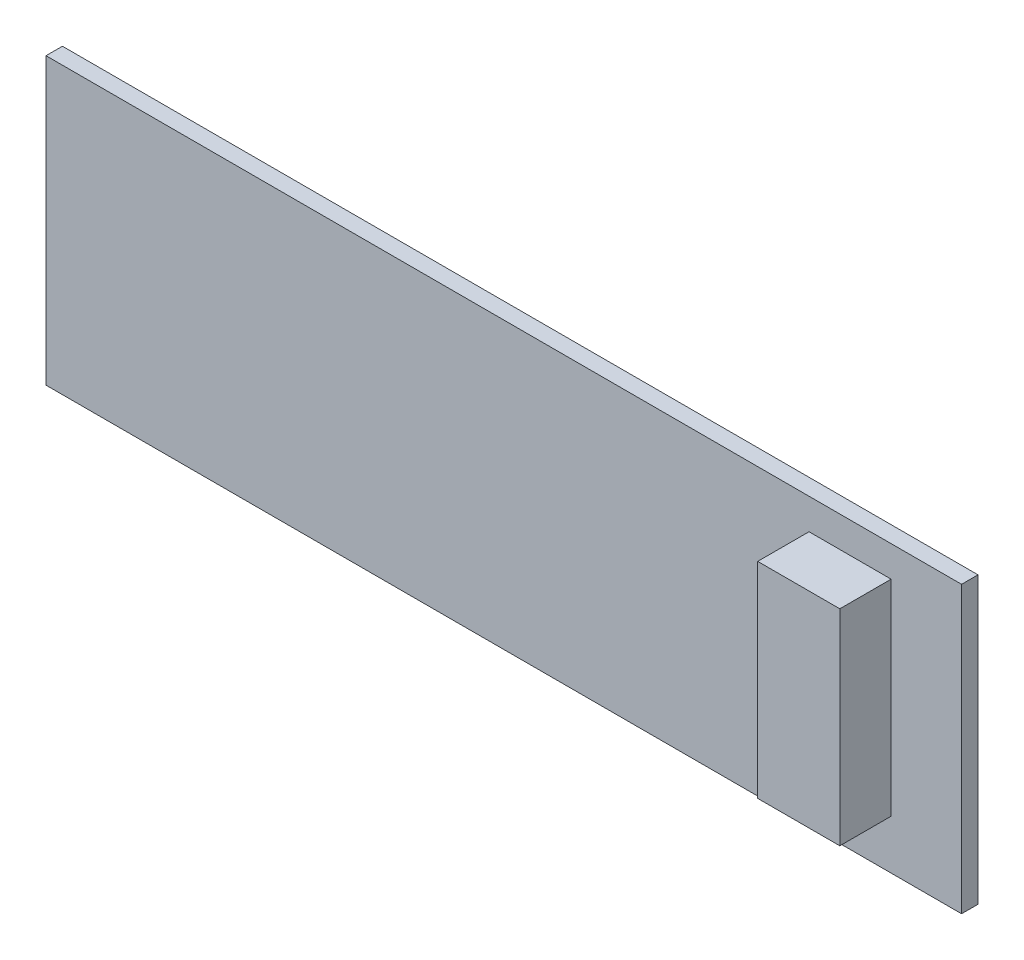
ISO-10303-21;
HEADER;
FILE_DESCRIPTION(('STEP AP214'),'2;1');
FILE_NAME('part.step','',(''),(''),'','','');
FILE_SCHEMA(('AUTOMOTIVE_DESIGN { 1 0 10303 214 1 1 1 1 }'));
ENDSEC;
DATA;
#1=APPLICATION_CONTEXT('core data for automotive mechanical design processes');
#2=APPLICATION_PROTOCOL_DEFINITION('international standard','automotive_design',2000,#1);
#3=PRODUCT_CONTEXT('',#1,'mechanical');
#4=PRODUCT('Part','Part','',(#3));
#5=PRODUCT_RELATED_PRODUCT_CATEGORY('part','',(#4));
#6=PRODUCT_DEFINITION_FORMATION('','',#4);
#7=PRODUCT_DEFINITION_CONTEXT('part definition',#1,'design');
#8=PRODUCT_DEFINITION('design','',#6,#7);
#9=PRODUCT_DEFINITION_SHAPE('','',#8);
#10=(LENGTH_UNIT() NAMED_UNIT(*) SI_UNIT(.MILLI.,.METRE.));
#11=(NAMED_UNIT(*) PLANE_ANGLE_UNIT() SI_UNIT($,.RADIAN.));
#12=(NAMED_UNIT(*) SI_UNIT($,.STERADIAN.) SOLID_ANGLE_UNIT());
#13=UNCERTAINTY_MEASURE_WITH_UNIT(LENGTH_MEASURE(1.E-05),#10,'distance_accuracy_value','');
#14=(GEOMETRIC_REPRESENTATION_CONTEXT(3) GLOBAL_UNCERTAINTY_ASSIGNED_CONTEXT((#13)) GLOBAL_UNIT_ASSIGNED_CONTEXT((#10,
#11,#12)) REPRESENTATION_CONTEXT('',''));
#15=CARTESIAN_POINT('',(0.,0.,0.));
#16=DIRECTION('',(0.,0.,1.));
#17=DIRECTION('',(1.,0.,0.));
#18=AXIS2_PLACEMENT_3D('',#15,#16,#17);
#19=CARTESIAN_POINT('',(0.,0.,5.));
#20=DIRECTION('',(0.,0.,1.));
#21=DIRECTION('',(1.,0.,0.));
#22=AXIS2_PLACEMENT_3D('',#19,#20,#21);
#23=PLANE('',#22);
#24=DIRECTION('',(0.,1.,0.));
#25=VECTOR('',#24,1.);
#26=CARTESIAN_POINT('',(37.7376156955747,-9.09684199121867,5.));
#27=LINE('',#26,#25);
#28=CARTESIAN_POINT('',(37.7376156955747,-9.09684199121867,5.));
#29=VERTEX_POINT('',#28);
#30=CARTESIAN_POINT('',(37.7376156955747,10.9031580087813,5.));
#31=VERTEX_POINT('',#30);
#32=EDGE_CURVE('E132',#29,#31,#27,.T.);
#33=ORIENTED_EDGE('',*,*,#32,.T.);
#34=DIRECTION('',(1.,0.,0.));
#35=VECTOR('',#34,1.);
#36=CARTESIAN_POINT('',(37.7376156955747,10.9031580087813,5.));
#37=LINE('',#36,#35);
#38=CARTESIAN_POINT('',(29.7376156955747,10.9031580087813,5.));
#39=VERTEX_POINT('',#38);
#40=EDGE_CURVE('E101',#31,#39,#37,.F.);
#41=ORIENTED_EDGE('',*,*,#40,.T.);
#42=DIRECTION('',(0.,1.,0.));
#43=VECTOR('',#42,1.);
#44=CARTESIAN_POINT('',(29.7376156955747,10.9031580087813,5.));
#45=LINE('',#44,#43);
#46=CARTESIAN_POINT('',(29.7376156955747,-9.09684199121867,5.));
#47=VERTEX_POINT('',#46);
#48=EDGE_CURVE('E83',#39,#47,#45,.F.);
#49=ORIENTED_EDGE('',*,*,#48,.T.);
#50=DIRECTION('',(-1.,0.,0.));
#51=VECTOR('',#50,1.);
#52=CARTESIAN_POINT('',(29.7376156955747,-9.09684199121867,5.));
#53=LINE('',#52,#51);
#54=EDGE_CURVE('E23',#47,#29,#53,.F.);
#55=ORIENTED_EDGE('',*,*,#54,.T.);
#56=EDGE_LOOP('',(#33,#41,#49,#55));
#57=FACE_BOUND('',#56,.T.);
#58=ADVANCED_FACE('F20',(#57),#23,.T.);
#59=CARTESIAN_POINT('',(29.7376156955747,-9.09684199121867,5.));
#60=DIRECTION('',(0.,1.,0.));
#61=DIRECTION('',(-1.,0.,0.));
#62=AXIS2_PLACEMENT_3D('',#59,#60,#61);
#63=PLANE('',#62);
#64=DIRECTION('',(0.,0.,1.));
#65=VECTOR('',#64,1.);
#66=CARTESIAN_POINT('',(37.7376156955747,-9.09684199121867,5.));
#67=LINE('',#66,#65);
#68=CARTESIAN_POINT('',(37.7376156955747,-9.09684199121867,0.));
#69=VERTEX_POINT('',#68);
#70=EDGE_CURVE('E93',#69,#29,#67,.T.);
#71=ORIENTED_EDGE('',*,*,#70,.T.);
#72=ORIENTED_EDGE('',*,*,#54,.F.);
#73=DIRECTION('',(0.,0.,-1.));
#74=VECTOR('',#73,1.);
#75=CARTESIAN_POINT('',(29.7376156955747,-9.09684199121867,5.));
#76=LINE('',#75,#74);
#77=CARTESIAN_POINT('',(29.7376156955747,-9.09684199121867,0.));
#78=VERTEX_POINT('',#77);
#79=EDGE_CURVE('E91',#47,#78,#76,.T.);
#80=ORIENTED_EDGE('',*,*,#79,.T.);
#81=DIRECTION('',(1.,0.,0.));
#82=VECTOR('',#81,1.);
#83=CARTESIAN_POINT('',(0.,-9.09684199121867,0.));
#84=LINE('',#83,#82);
#85=EDGE_CURVE('E125',#69,#78,#84,.F.);
#86=ORIENTED_EDGE('',*,*,#85,.F.);
#87=EDGE_LOOP('',(#71,#72,#80,#86));
#88=FACE_BOUND('',#87,.T.);
#89=ADVANCED_FACE('F89',(#88),#63,.F.);
#90=CARTESIAN_POINT('',(29.7376156955747,10.9031580087813,5.));
#91=DIRECTION('',(1.,0.,0.));
#92=DIRECTION('',(0.,0.,-1.));
#93=AXIS2_PLACEMENT_3D('',#90,#91,#92);
#94=PLANE('',#93);
#95=ORIENTED_EDGE('',*,*,#79,.F.);
#96=ORIENTED_EDGE('',*,*,#48,.F.);
#97=DIRECTION('',(0.,0.,1.));
#98=VECTOR('',#97,1.);
#99=CARTESIAN_POINT('',(29.7376156955747,10.9031580087813,5.));
#100=LINE('',#99,#98);
#101=CARTESIAN_POINT('',(29.7376156955747,10.9031580087813,0.));
#102=VERTEX_POINT('',#101);
#103=EDGE_CURVE('E137',#39,#102,#100,.F.);
#104=ORIENTED_EDGE('',*,*,#103,.T.);
#105=DIRECTION('',(0.,1.,0.));
#106=VECTOR('',#105,1.);
#107=CARTESIAN_POINT('',(29.7376156955747,0.,0.));
#108=LINE('',#107,#106);
#109=EDGE_CURVE('E99',#78,#102,#108,.T.);
#110=ORIENTED_EDGE('',*,*,#109,.F.);
#111=EDGE_LOOP('',(#95,#96,#104,#110));
#112=FACE_BOUND('',#111,.T.);
#113=ADVANCED_FACE('F98',(#112),#94,.F.);
#114=CARTESIAN_POINT('',(37.7376156955747,10.9031580087813,5.));
#115=DIRECTION('',(0.,-1.,0.));
#116=DIRECTION('',(1.,0.,0.));
#117=AXIS2_PLACEMENT_3D('',#114,#115,#116);
#118=PLANE('',#117);
#119=ORIENTED_EDGE('',*,*,#103,.F.);
#120=ORIENTED_EDGE('',*,*,#40,.F.);
#121=DIRECTION('',(0.,0.,1.));
#122=VECTOR('',#121,1.);
#123=CARTESIAN_POINT('',(37.7376156955747,10.9031580087813,5.));
#124=LINE('',#123,#122);
#125=CARTESIAN_POINT('',(37.7376156955747,10.9031580087813,0.));
#126=VERTEX_POINT('',#125);
#127=EDGE_CURVE('E128',#31,#126,#124,.F.);
#128=ORIENTED_EDGE('',*,*,#127,.T.);
#129=DIRECTION('',(1.,0.,0.));
#130=VECTOR('',#129,1.);
#131=CARTESIAN_POINT('',(0.,10.9031580087813,0.));
#132=LINE('',#131,#130);
#133=EDGE_CURVE('E116',#102,#126,#132,.T.);
#134=ORIENTED_EDGE('',*,*,#133,.F.);
#135=EDGE_LOOP('',(#119,#120,#128,#134));
#136=FACE_BOUND('',#135,.T.);
#137=ADVANCED_FACE('F144',(#136),#118,.F.);
#138=CARTESIAN_POINT('',(37.7376156955747,-9.09684199121867,5.));
#139=DIRECTION('',(-1.,0.,0.));
#140=DIRECTION('',(0.,0.,1.));
#141=AXIS2_PLACEMENT_3D('',#138,#139,#140);
#142=PLANE('',#141);
#143=ORIENTED_EDGE('',*,*,#127,.F.);
#144=ORIENTED_EDGE('',*,*,#32,.F.);
#145=ORIENTED_EDGE('',*,*,#70,.F.);
#146=DIRECTION('',(0.,1.,0.));
#147=VECTOR('',#146,1.);
#148=CARTESIAN_POINT('',(37.7376156955747,0.,0.));
#149=LINE('',#148,#147);
#150=EDGE_CURVE('E121',#126,#69,#149,.F.);
#151=ORIENTED_EDGE('',*,*,#150,.F.);
#152=EDGE_LOOP('',(#143,#144,#145,#151));
#153=FACE_BOUND('',#152,.T.);
#154=ADVANCED_FACE('F220',(#153),#142,.F.);
#155=CARTESIAN_POINT('',(0.,0.,0.));
#156=DIRECTION('',(0.,0.,1.));
#157=DIRECTION('',(1.,0.,0.));
#158=AXIS2_PLACEMENT_3D('',#155,#156,#157);
#159=PLANE('',#158);
#160=ORIENTED_EDGE('',*,*,#133,.T.);
#161=ORIENTED_EDGE('',*,*,#150,.T.);
#162=ORIENTED_EDGE('',*,*,#85,.T.);
#163=ORIENTED_EDGE('',*,*,#109,.T.);
#164=EDGE_LOOP('',(#160,#161,#162,#163));
#165=FACE_BOUND('',#164,.T.);
#166=DIRECTION('',(1.,0.,0.));
#167=VECTOR('',#166,1.);
#168=CARTESIAN_POINT('',(-44.6,-13.9,0.));
#169=LINE('',#168,#167);
#170=CARTESIAN_POINT('',(44.6,-13.9,0.));
#171=VERTEX_POINT('',#170);
#172=CARTESIAN_POINT('',(-44.6,-13.9,0.));
#173=VERTEX_POINT('',#172);
#174=EDGE_CURVE('E155',#171,#173,#169,.F.);
#175=ORIENTED_EDGE('',*,*,#174,.F.);
#176=DIRECTION('',(0.,1.,0.));
#177=VECTOR('',#176,1.);
#178=CARTESIAN_POINT('',(44.6,-13.9,0.));
#179=LINE('',#178,#177);
#180=CARTESIAN_POINT('',(44.6,13.9,0.));
#181=VERTEX_POINT('',#180);
#182=EDGE_CURVE('E167',#181,#171,#179,.F.);
#183=ORIENTED_EDGE('',*,*,#182,.F.);
#184=DIRECTION('',(1.,0.,0.));
#185=VECTOR('',#184,1.);
#186=CARTESIAN_POINT('',(44.6,13.9,0.));
#187=LINE('',#186,#185);
#188=CARTESIAN_POINT('',(-44.6,13.9,0.));
#189=VERTEX_POINT('',#188);
#190=EDGE_CURVE('E173',#189,#181,#187,.T.);
#191=ORIENTED_EDGE('',*,*,#190,.F.);
#192=DIRECTION('',(0.,1.,0.));
#193=VECTOR('',#192,1.);
#194=CARTESIAN_POINT('',(-44.6,13.9,0.));
#195=LINE('',#194,#193);
#196=EDGE_CURVE('E153',#173,#189,#195,.T.);
#197=ORIENTED_EDGE('',*,*,#196,.F.);
#198=EDGE_LOOP('',(#175,#183,#191,#197));
#199=FACE_BOUND('',#198,.T.);
#200=ADVANCED_FACE('F149',(#165,#199),#159,.T.);
#201=CARTESIAN_POINT('',(-44.6,13.9,-1.6));
#202=DIRECTION('',(-1.,0.,0.));
#203=DIRECTION('',(0.,0.,1.));
#204=AXIS2_PLACEMENT_3D('',#201,#202,#203);
#205=PLANE('',#204);
#206=DIRECTION('',(0.,1.,0.));
#207=VECTOR('',#206,1.);
#208=CARTESIAN_POINT('',(-44.6,0.,-1.6));
#209=LINE('',#208,#207);
#210=CARTESIAN_POINT('',(-44.6,13.9,-1.6));
#211=VERTEX_POINT('',#210);
#212=CARTESIAN_POINT('',(-44.6,-13.9,-1.6));
#213=VERTEX_POINT('',#212);
#214=EDGE_CURVE('E181',#211,#213,#209,.F.);
#215=ORIENTED_EDGE('',*,*,#214,.T.);
#216=DIRECTION('',(0.,0.,-1.));
#217=VECTOR('',#216,1.);
#218=CARTESIAN_POINT('',(-44.6,-13.9,-1.6));
#219=LINE('',#218,#217);
#220=EDGE_CURVE('E162',#173,#213,#219,.T.);
#221=ORIENTED_EDGE('',*,*,#220,.F.);
#222=ORIENTED_EDGE('',*,*,#196,.T.);
#223=DIRECTION('',(0.,0.,1.));
#224=VECTOR('',#223,1.);
#225=CARTESIAN_POINT('',(-44.6,13.9,-1.6));
#226=LINE('',#225,#224);
#227=EDGE_CURVE('E178',#211,#189,#226,.T.);
#228=ORIENTED_EDGE('',*,*,#227,.F.);
#229=EDGE_LOOP('',(#215,#221,#222,#228));
#230=FACE_BOUND('',#229,.T.);
#231=ADVANCED_FACE('F201',(#230),#205,.T.);
#232=CARTESIAN_POINT('',(-44.6,-13.9,-1.6));
#233=DIRECTION('',(0.,-1.,0.));
#234=DIRECTION('',(0.,0.,-1.));
#235=AXIS2_PLACEMENT_3D('',#232,#233,#234);
#236=PLANE('',#235);
#237=DIRECTION('',(1.,0.,0.));
#238=VECTOR('',#237,1.);
#239=CARTESIAN_POINT('',(0.,-13.9,-1.6));
#240=LINE('',#239,#238);
#241=CARTESIAN_POINT('',(44.6,-13.9,-1.6));
#242=VERTEX_POINT('',#241);
#243=EDGE_CURVE('E184',#213,#242,#240,.T.);
#244=ORIENTED_EDGE('',*,*,#243,.T.);
#245=DIRECTION('',(0.,0.,-1.));
#246=VECTOR('',#245,1.);
#247=CARTESIAN_POINT('',(44.6,-13.9,-1.6));
#248=LINE('',#247,#246);
#249=EDGE_CURVE('E170',#171,#242,#248,.T.);
#250=ORIENTED_EDGE('',*,*,#249,.F.);
#251=ORIENTED_EDGE('',*,*,#174,.T.);
#252=ORIENTED_EDGE('',*,*,#220,.T.);
#253=EDGE_LOOP('',(#244,#250,#251,#252));
#254=FACE_BOUND('',#253,.T.);
#255=ADVANCED_FACE('F199',(#254),#236,.T.);
#256=CARTESIAN_POINT('',(44.6,-13.9,-1.6));
#257=DIRECTION('',(1.,0.,0.));
#258=DIRECTION('',(0.,0.,-1.));
#259=AXIS2_PLACEMENT_3D('',#256,#257,#258);
#260=PLANE('',#259);
#261=DIRECTION('',(0.,1.,0.));
#262=VECTOR('',#261,1.);
#263=CARTESIAN_POINT('',(44.6,0.,-1.6));
#264=LINE('',#263,#262);
#265=CARTESIAN_POINT('',(44.6,13.9,-1.6));
#266=VERTEX_POINT('',#265);
#267=EDGE_CURVE('E30',#242,#266,#264,.T.);
#268=ORIENTED_EDGE('',*,*,#267,.T.);
#269=DIRECTION('',(0.,0.,1.));
#270=VECTOR('',#269,1.);
#271=CARTESIAN_POINT('',(44.6,13.9,-1.6));
#272=LINE('',#271,#270);
#273=EDGE_CURVE('E38',#181,#266,#272,.F.);
#274=ORIENTED_EDGE('',*,*,#273,.F.);
#275=ORIENTED_EDGE('',*,*,#182,.T.);
#276=ORIENTED_EDGE('',*,*,#249,.T.);
#277=EDGE_LOOP('',(#268,#274,#275,#276));
#278=FACE_BOUND('',#277,.T.);
#279=ADVANCED_FACE('F193',(#278),#260,.T.);
#280=CARTESIAN_POINT('',(44.6,13.9,-1.6));
#281=DIRECTION('',(0.,1.,0.));
#282=DIRECTION('',(0.,0.,1.));
#283=AXIS2_PLACEMENT_3D('',#280,#281,#282);
#284=PLANE('',#283);
#285=DIRECTION('',(1.,0.,0.));
#286=VECTOR('',#285,1.);
#287=CARTESIAN_POINT('',(0.,13.9,-1.6));
#288=LINE('',#287,#286);
#289=EDGE_CURVE('E12',#266,#211,#288,.F.);
#290=ORIENTED_EDGE('',*,*,#289,.T.);
#291=ORIENTED_EDGE('',*,*,#227,.T.);
#292=ORIENTED_EDGE('',*,*,#190,.T.);
#293=ORIENTED_EDGE('',*,*,#273,.T.);
#294=EDGE_LOOP('',(#290,#291,#292,#293));
#295=FACE_BOUND('',#294,.T.);
#296=ADVANCED_FACE('F203',(#295),#284,.T.);
#297=CARTESIAN_POINT('',(0.,0.,-1.6));
#298=DIRECTION('',(0.,0.,1.));
#299=DIRECTION('',(1.,0.,0.));
#300=AXIS2_PLACEMENT_3D('',#297,#298,#299);
#301=PLANE('',#300);
#302=ORIENTED_EDGE('',*,*,#267,.F.);
#303=ORIENTED_EDGE('',*,*,#243,.F.);
#304=ORIENTED_EDGE('',*,*,#214,.F.);
#305=ORIENTED_EDGE('',*,*,#289,.F.);
#306=EDGE_LOOP('',(#302,#303,#304,#305));
#307=FACE_BOUND('',#306,.T.);
#308=ADVANCED_FACE('F197',(#307),#301,.F.);
#309=CLOSED_SHELL('',(#58,#89,#113,#137,#154,#200,#231,#255,#279,#296,#308));
#310=MANIFOLD_SOLID_BREP('B1',#309);
#311=ADVANCED_BREP_SHAPE_REPRESENTATION('',(#18,#310),#14);
#312=SHAPE_DEFINITION_REPRESENTATION(#9,#311);
ENDSEC;
END-ISO-10303-21;
